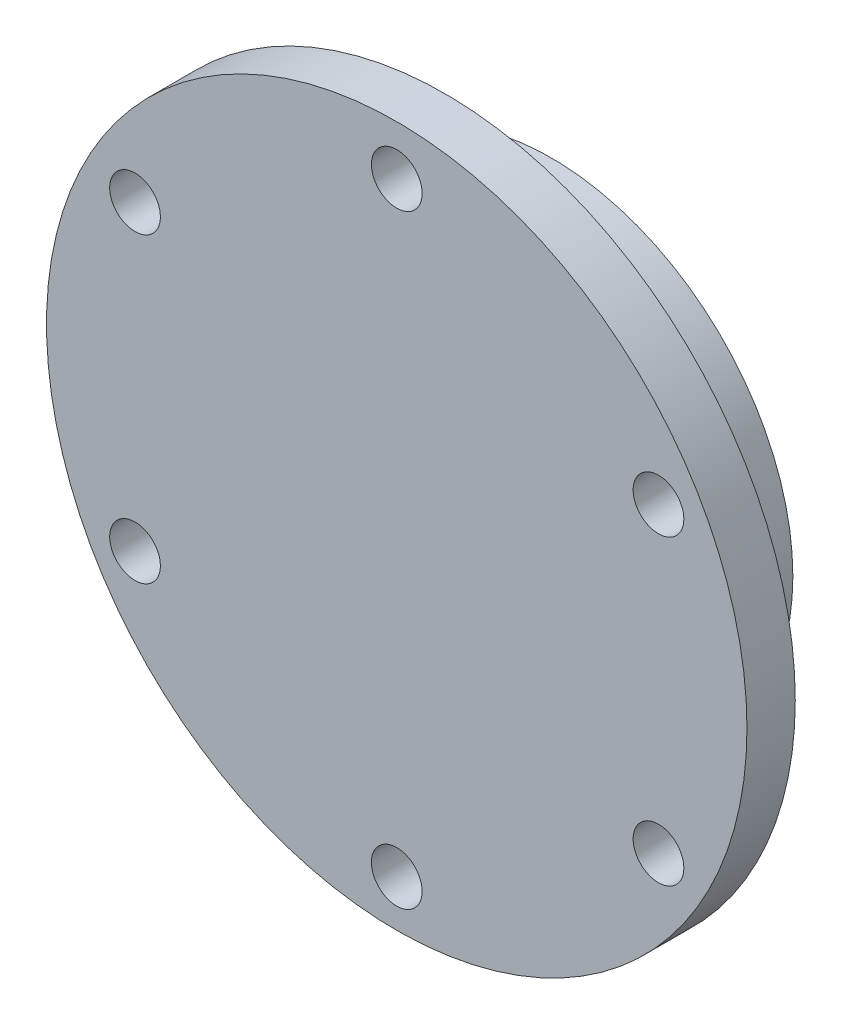
ISO-10303-21;
HEADER;
FILE_DESCRIPTION(('STEP AP214'),'2;1');
FILE_NAME('part.step','',(''),(''),'','','');
FILE_SCHEMA(('AUTOMOTIVE_DESIGN { 1 0 10303 214 1 1 1 1 }'));
ENDSEC;
DATA;
#1=APPLICATION_CONTEXT('core data for automotive mechanical design processes');
#2=APPLICATION_PROTOCOL_DEFINITION('international standard','automotive_design',2000,#1);
#3=PRODUCT_CONTEXT('',#1,'mechanical');
#4=PRODUCT('Part','Part','',(#3));
#5=PRODUCT_RELATED_PRODUCT_CATEGORY('part','',(#4));
#6=PRODUCT_DEFINITION_FORMATION('','',#4);
#7=PRODUCT_DEFINITION_CONTEXT('part definition',#1,'design');
#8=PRODUCT_DEFINITION('design','',#6,#7);
#9=PRODUCT_DEFINITION_SHAPE('','',#8);
#10=(LENGTH_UNIT() NAMED_UNIT(*) SI_UNIT(.MILLI.,.METRE.));
#11=(NAMED_UNIT(*) PLANE_ANGLE_UNIT() SI_UNIT($,.RADIAN.));
#12=(NAMED_UNIT(*) SI_UNIT($,.STERADIAN.) SOLID_ANGLE_UNIT());
#13=UNCERTAINTY_MEASURE_WITH_UNIT(LENGTH_MEASURE(1.E-05),#10,'distance_accuracy_value','');
#14=(GEOMETRIC_REPRESENTATION_CONTEXT(3) GLOBAL_UNCERTAINTY_ASSIGNED_CONTEXT((#13)) GLOBAL_UNIT_ASSIGNED_CONTEXT((#10,
#11,#12)) REPRESENTATION_CONTEXT('',''));
#15=CARTESIAN_POINT('',(0.,0.,0.));
#16=DIRECTION('',(0.,0.,1.));
#17=DIRECTION('',(1.,0.,0.));
#18=AXIS2_PLACEMENT_3D('',#15,#16,#17);
#19=CARTESIAN_POINT('',(0.,0.,0.));
#20=DIRECTION('',(0.,0.,1.));
#21=DIRECTION('',(1.,0.,0.));
#22=AXIS2_PLACEMENT_3D('',#19,#20,#21);
#23=PLANE('',#22);
#24=CARTESIAN_POINT('',(0.,0.,0.));
#25=DIRECTION('',(0.,0.,-1.));
#26=DIRECTION('',(-1.,0.,0.));
#27=AXIS2_PLACEMENT_3D('',#24,#25,#26);
#28=CIRCLE('',#27,50.);
#29=CARTESIAN_POINT('',(-50.,0.,0.));
#30=VERTEX_POINT('',#29);
#31=EDGE_CURVE('E12',#30,#30,#28,.T.);
#32=ORIENTED_EDGE('',*,*,#31,.F.);
#33=EDGE_LOOP('',(#32));
#34=FACE_BOUND('',#33,.T.);
#35=CARTESIAN_POINT('',(-54.180005377678,30.9527824078323,0.));
#36=DIRECTION('',(0.,0.,-1.));
#37=DIRECTION('',(-1.,0.,0.));
#38=AXIS2_PLACEMENT_3D('',#35,#36,#37);
#39=CIRCLE('',#38,5.25);
#40=CARTESIAN_POINT('',(-59.430005377678,30.9527824078323,0.));
#41=VERTEX_POINT('',#40);
#42=EDGE_CURVE('E59',#41,#41,#39,.T.);
#43=ORIENTED_EDGE('',*,*,#42,.F.);
#44=EDGE_LOOP('',(#43));
#45=FACE_BOUND('',#44,.T.);
#46=CARTESIAN_POINT('',(-54.1800053776787,-31.6088989711638,0.));
#47=DIRECTION('',(0.,0.,-1.));
#48=DIRECTION('',(-1.,0.,0.));
#49=AXIS2_PLACEMENT_3D('',#46,#47,#48);
#50=CIRCLE('',#49,5.25);
#51=CARTESIAN_POINT('',(-59.4300053776787,-31.6088989711638,0.));
#52=VERTEX_POINT('',#51);
#53=EDGE_CURVE('E65',#52,#52,#50,.T.);
#54=ORIENTED_EDGE('',*,*,#53,.F.);
#55=EDGE_LOOP('',(#54));
#56=FACE_BOUND('',#55,.T.);
#57=CARTESIAN_POINT('',(54.1800053776783,-31.6088989711646,0.));
#58=DIRECTION('',(0.,0.,-1.));
#59=DIRECTION('',(-1.,0.,0.));
#60=AXIS2_PLACEMENT_3D('',#57,#58,#59);
#61=CIRCLE('',#60,5.25);
#62=CARTESIAN_POINT('',(48.9300053776783,-31.6088989711646,0.));
#63=VERTEX_POINT('',#62);
#64=EDGE_CURVE('E77',#63,#63,#61,.T.);
#65=ORIENTED_EDGE('',*,*,#64,.F.);
#66=EDGE_LOOP('',(#65));
#67=FACE_BOUND('',#66,.T.);
#68=CARTESIAN_POINT('',(54.1800053776785,30.9527824078316,0.));
#69=DIRECTION('',(0.,0.,-1.));
#70=DIRECTION('',(-1.,0.,0.));
#71=AXIS2_PLACEMENT_3D('',#68,#69,#70);
#72=CIRCLE('',#71,5.25);
#73=CARTESIAN_POINT('',(48.9300053776785,30.9527824078316,0.));
#74=VERTEX_POINT('',#73);
#75=EDGE_CURVE('E83',#74,#74,#72,.T.);
#76=ORIENTED_EDGE('',*,*,#75,.F.);
#77=EDGE_LOOP('',(#76));
#78=FACE_BOUND('',#77,.T.);
#79=CARTESIAN_POINT('',(0.,62.2336230973297,0.));
#80=DIRECTION('',(0.,0.,-1.));
#81=DIRECTION('',(-1.,0.,0.));
#82=AXIS2_PLACEMENT_3D('',#79,#80,#81);
#83=CIRCLE('',#82,5.25);
#84=CARTESIAN_POINT('',(-5.25,62.2336230973297,0.));
#85=VERTEX_POINT('',#84);
#86=EDGE_CURVE('E89',#85,#85,#83,.T.);
#87=ORIENTED_EDGE('',*,*,#86,.F.);
#88=EDGE_LOOP('',(#87));
#89=FACE_BOUND('',#88,.T.);
#90=CARTESIAN_POINT('',(0.,0.,0.));
#91=DIRECTION('',(0.,0.,1.));
#92=DIRECTION('',(1.,0.,0.));
#93=AXIS2_PLACEMENT_3D('',#90,#91,#92);
#94=CIRCLE('',#93,72.5);
#95=CARTESIAN_POINT('',(72.5,0.,0.));
#96=VERTEX_POINT('',#95);
#97=EDGE_CURVE('E47',#96,#96,#94,.T.);
#98=ORIENTED_EDGE('',*,*,#97,.F.);
#99=EDGE_LOOP('',(#98));
#100=FACE_BOUND('',#99,.T.);
#101=CARTESIAN_POINT('',(0.,-62.8897396606623,0.));
#102=DIRECTION('',(0.,0.,-1.));
#103=DIRECTION('',(-1.,0.,0.));
#104=AXIS2_PLACEMENT_3D('',#101,#102,#103);
#105=CIRCLE('',#104,5.25);
#106=CARTESIAN_POINT('',(-5.25,-62.8897396606623,0.));
#107=VERTEX_POINT('',#106);
#108=EDGE_CURVE('E71',#107,#107,#105,.T.);
#109=ORIENTED_EDGE('',*,*,#108,.F.);
#110=EDGE_LOOP('',(#109));
#111=FACE_BOUND('',#110,.T.);
#112=ADVANCED_FACE('F43',(#34,#45,#56,#67,#78,#89,#100,#111),#23,.F.);
#113=CARTESIAN_POINT('',(0.,0.,10.));
#114=DIRECTION('',(0.,0.,-1.));
#115=DIRECTION('',(-1.,0.,0.));
#116=AXIS2_PLACEMENT_3D('',#113,#114,#115);
#117=CYLINDRICAL_SURFACE('',#116,72.5);
#118=CARTESIAN_POINT('',(0.,0.,10.));
#119=DIRECTION('',(0.,0.,1.));
#120=DIRECTION('',(1.,0.,0.));
#121=AXIS2_PLACEMENT_3D('',#118,#119,#120);
#122=CIRCLE('',#121,72.5);
#123=CARTESIAN_POINT('',(72.5,0.,10.));
#124=VERTEX_POINT('',#123);
#125=EDGE_CURVE('E51',#124,#124,#122,.T.);
#126=ORIENTED_EDGE('',*,*,#125,.F.);
#127=EDGE_LOOP('',(#126));
#128=FACE_BOUND('',#127,.T.);
#129=ORIENTED_EDGE('',*,*,#97,.T.);
#130=EDGE_LOOP('',(#129));
#131=FACE_BOUND('',#130,.T.);
#132=ADVANCED_FACE('F45',(#128,#131),#117,.T.);
#133=CARTESIAN_POINT('',(0.,0.,10.));
#134=DIRECTION('',(0.,0.,1.));
#135=DIRECTION('',(1.,0.,0.));
#136=AXIS2_PLACEMENT_3D('',#133,#134,#135);
#137=PLANE('',#136);
#138=CARTESIAN_POINT('',(-54.180005377678,30.9527824078323,10.));
#139=DIRECTION('',(0.,0.,1.));
#140=DIRECTION('',(1.,0.,0.));
#141=AXIS2_PLACEMENT_3D('',#138,#139,#140);
#142=CIRCLE('',#141,5.24999999999999);
#143=CARTESIAN_POINT('',(-48.9300053776781,30.9527824078323,10.));
#144=VERTEX_POINT('',#143);
#145=EDGE_CURVE('E62',#144,#144,#142,.T.);
#146=ORIENTED_EDGE('',*,*,#145,.F.);
#147=EDGE_LOOP('',(#146));
#148=FACE_BOUND('',#147,.T.);
#149=CARTESIAN_POINT('',(-54.1800053776787,-31.6088989711638,10.));
#150=DIRECTION('',(0.,0.,1.));
#151=DIRECTION('',(1.,0.,0.));
#152=AXIS2_PLACEMENT_3D('',#149,#150,#151);
#153=CIRCLE('',#152,5.24999999999999);
#154=CARTESIAN_POINT('',(-48.9300053776787,-31.6088989711638,10.));
#155=VERTEX_POINT('',#154);
#156=EDGE_CURVE('E68',#155,#155,#153,.T.);
#157=ORIENTED_EDGE('',*,*,#156,.F.);
#158=EDGE_LOOP('',(#157));
#159=FACE_BOUND('',#158,.T.);
#160=CARTESIAN_POINT('',(0.,-62.8897396606623,10.));
#161=DIRECTION('',(0.,0.,1.));
#162=DIRECTION('',(1.,0.,0.));
#163=AXIS2_PLACEMENT_3D('',#160,#161,#162);
#164=CIRCLE('',#163,5.24999999999999);
#165=CARTESIAN_POINT('',(5.24999999999999,-62.8897396606623,10.));
#166=VERTEX_POINT('',#165);
#167=EDGE_CURVE('E74',#166,#166,#164,.T.);
#168=ORIENTED_EDGE('',*,*,#167,.F.);
#169=EDGE_LOOP('',(#168));
#170=FACE_BOUND('',#169,.T.);
#171=CARTESIAN_POINT('',(54.1800053776783,-31.6088989711646,10.));
#172=DIRECTION('',(0.,0.,1.));
#173=DIRECTION('',(1.,0.,0.));
#174=AXIS2_PLACEMENT_3D('',#171,#172,#173);
#175=CIRCLE('',#174,5.24999999999999);
#176=CARTESIAN_POINT('',(59.4300053776783,-31.6088989711646,10.));
#177=VERTEX_POINT('',#176);
#178=EDGE_CURVE('E80',#177,#177,#175,.T.);
#179=ORIENTED_EDGE('',*,*,#178,.F.);
#180=EDGE_LOOP('',(#179));
#181=FACE_BOUND('',#180,.T.);
#182=CARTESIAN_POINT('',(54.1800053776785,30.9527824078316,10.));
#183=DIRECTION('',(0.,0.,1.));
#184=DIRECTION('',(1.,0.,0.));
#185=AXIS2_PLACEMENT_3D('',#182,#183,#184);
#186=CIRCLE('',#185,5.24999999999999);
#187=CARTESIAN_POINT('',(59.4300053776785,30.9527824078316,10.));
#188=VERTEX_POINT('',#187);
#189=EDGE_CURVE('E86',#188,#188,#186,.T.);
#190=ORIENTED_EDGE('',*,*,#189,.F.);
#191=EDGE_LOOP('',(#190));
#192=FACE_BOUND('',#191,.T.);
#193=CARTESIAN_POINT('',(0.,62.2336230973297,10.));
#194=DIRECTION('',(0.,0.,1.));
#195=DIRECTION('',(1.,0.,0.));
#196=AXIS2_PLACEMENT_3D('',#193,#194,#195);
#197=CIRCLE('',#196,5.24999999999999);
#198=CARTESIAN_POINT('',(5.24999999999999,62.2336230973297,10.));
#199=VERTEX_POINT('',#198);
#200=EDGE_CURVE('E92',#199,#199,#197,.T.);
#201=ORIENTED_EDGE('',*,*,#200,.F.);
#202=EDGE_LOOP('',(#201));
#203=FACE_BOUND('',#202,.T.);
#204=ORIENTED_EDGE('',*,*,#125,.T.);
#205=EDGE_LOOP('',(#204));
#206=FACE_BOUND('',#205,.T.);
#207=ADVANCED_FACE('F129',(#148,#159,#170,#181,#192,#203,#206),#137,.T.);
#208=CARTESIAN_POINT('',(0.,62.2336230973297,0.));
#209=DIRECTION('',(0.,0.,-1.));
#210=DIRECTION('',(-1.,0.,0.));
#211=AXIS2_PLACEMENT_3D('',#208,#209,#210);
#212=CYLINDRICAL_SURFACE('',#211,5.24999999999999);
#213=ORIENTED_EDGE('',*,*,#200,.T.);
#214=EDGE_LOOP('',(#213));
#215=FACE_BOUND('',#214,.T.);
#216=ORIENTED_EDGE('',*,*,#86,.T.);
#217=EDGE_LOOP('',(#216));
#218=FACE_BOUND('',#217,.T.);
#219=ADVANCED_FACE('F125',(#215,#218),#212,.F.);
#220=CARTESIAN_POINT('',(54.1800053776785,30.9527824078316,0.));
#221=DIRECTION('',(0.,0.,-1.));
#222=DIRECTION('',(-1.,0.,0.));
#223=AXIS2_PLACEMENT_3D('',#220,#221,#222);
#224=CYLINDRICAL_SURFACE('',#223,5.24999999999999);
#225=ORIENTED_EDGE('',*,*,#189,.T.);
#226=EDGE_LOOP('',(#225));
#227=FACE_BOUND('',#226,.T.);
#228=ORIENTED_EDGE('',*,*,#75,.T.);
#229=EDGE_LOOP('',(#228));
#230=FACE_BOUND('',#229,.T.);
#231=ADVANCED_FACE('F118',(#227,#230),#224,.F.);
#232=CARTESIAN_POINT('',(54.1800053776783,-31.6088989711646,0.));
#233=DIRECTION('',(0.,0.,-1.));
#234=DIRECTION('',(-1.,0.,0.));
#235=AXIS2_PLACEMENT_3D('',#232,#233,#234);
#236=CYLINDRICAL_SURFACE('',#235,5.24999999999999);
#237=ORIENTED_EDGE('',*,*,#178,.T.);
#238=EDGE_LOOP('',(#237));
#239=FACE_BOUND('',#238,.T.);
#240=ORIENTED_EDGE('',*,*,#64,.T.);
#241=EDGE_LOOP('',(#240));
#242=FACE_BOUND('',#241,.T.);
#243=ADVANCED_FACE('F108',(#239,#242),#236,.F.);
#244=CARTESIAN_POINT('',(0.,-62.8897396606623,0.));
#245=DIRECTION('',(0.,0.,-1.));
#246=DIRECTION('',(-1.,0.,0.));
#247=AXIS2_PLACEMENT_3D('',#244,#245,#246);
#248=CYLINDRICAL_SURFACE('',#247,5.24999999999999);
#249=ORIENTED_EDGE('',*,*,#167,.T.);
#250=EDGE_LOOP('',(#249));
#251=FACE_BOUND('',#250,.T.);
#252=ORIENTED_EDGE('',*,*,#108,.T.);
#253=EDGE_LOOP('',(#252));
#254=FACE_BOUND('',#253,.T.);
#255=ADVANCED_FACE('F105',(#251,#254),#248,.F.);
#256=CARTESIAN_POINT('',(-54.1800053776787,-31.6088989711638,0.));
#257=DIRECTION('',(0.,0.,-1.));
#258=DIRECTION('',(-1.,0.,0.));
#259=AXIS2_PLACEMENT_3D('',#256,#257,#258);
#260=CYLINDRICAL_SURFACE('',#259,5.24999999999999);
#261=ORIENTED_EDGE('',*,*,#156,.T.);
#262=EDGE_LOOP('',(#261));
#263=FACE_BOUND('',#262,.T.);
#264=ORIENTED_EDGE('',*,*,#53,.T.);
#265=EDGE_LOOP('',(#264));
#266=FACE_BOUND('',#265,.T.);
#267=ADVANCED_FACE('F107',(#263,#266),#260,.F.);
#268=CARTESIAN_POINT('',(-54.180005377678,30.9527824078323,0.));
#269=DIRECTION('',(0.,0.,-1.));
#270=DIRECTION('',(-1.,0.,0.));
#271=AXIS2_PLACEMENT_3D('',#268,#269,#270);
#272=CYLINDRICAL_SURFACE('',#271,5.24999999999999);
#273=ORIENTED_EDGE('',*,*,#145,.T.);
#274=EDGE_LOOP('',(#273));
#275=FACE_BOUND('',#274,.T.);
#276=ORIENTED_EDGE('',*,*,#42,.T.);
#277=EDGE_LOOP('',(#276));
#278=FACE_BOUND('',#277,.T.);
#279=ADVANCED_FACE('F115',(#275,#278),#272,.F.);
#280=CARTESIAN_POINT('',(0.,0.,-22.));
#281=DIRECTION('',(0.,0.,1.));
#282=DIRECTION('',(1.,0.,0.));
#283=AXIS2_PLACEMENT_3D('',#280,#281,#282);
#284=CYLINDRICAL_SURFACE('',#283,50.);
#285=CARTESIAN_POINT('',(0.,0.,-22.));
#286=DIRECTION('',(0.,0.,-1.));
#287=DIRECTION('',(-1.,0.,0.));
#288=AXIS2_PLACEMENT_3D('',#285,#286,#287);
#289=CIRCLE('',#288,50.);
#290=CARTESIAN_POINT('',(-50.,0.,-22.));
#291=VERTEX_POINT('',#290);
#292=EDGE_CURVE('E58',#291,#291,#289,.T.);
#293=ORIENTED_EDGE('',*,*,#292,.F.);
#294=EDGE_LOOP('',(#293));
#295=FACE_BOUND('',#294,.T.);
#296=ORIENTED_EDGE('',*,*,#31,.T.);
#297=EDGE_LOOP('',(#296));
#298=FACE_BOUND('',#297,.T.);
#299=ADVANCED_FACE('F163',(#295,#298),#284,.T.);
#300=CARTESIAN_POINT('',(0.,0.,-22.));
#301=DIRECTION('',(0.,0.,-1.));
#302=DIRECTION('',(-1.,0.,0.));
#303=AXIS2_PLACEMENT_3D('',#300,#301,#302);
#304=PLANE('',#303);
#305=ORIENTED_EDGE('',*,*,#292,.T.);
#306=EDGE_LOOP('',(#305));
#307=FACE_BOUND('',#306,.T.);
#308=ADVANCED_FACE('F169',(#307),#304,.T.);
#309=CLOSED_SHELL('',(#112,#132,#207,#219,#231,#243,#255,#267,#279,#299,#308));
#310=MANIFOLD_SOLID_BREP('B2',#309);
#311=ADVANCED_BREP_SHAPE_REPRESENTATION('',(#18,#310),#14);
#312=SHAPE_DEFINITION_REPRESENTATION(#9,#311);
ENDSEC;
END-ISO-10303-21;
